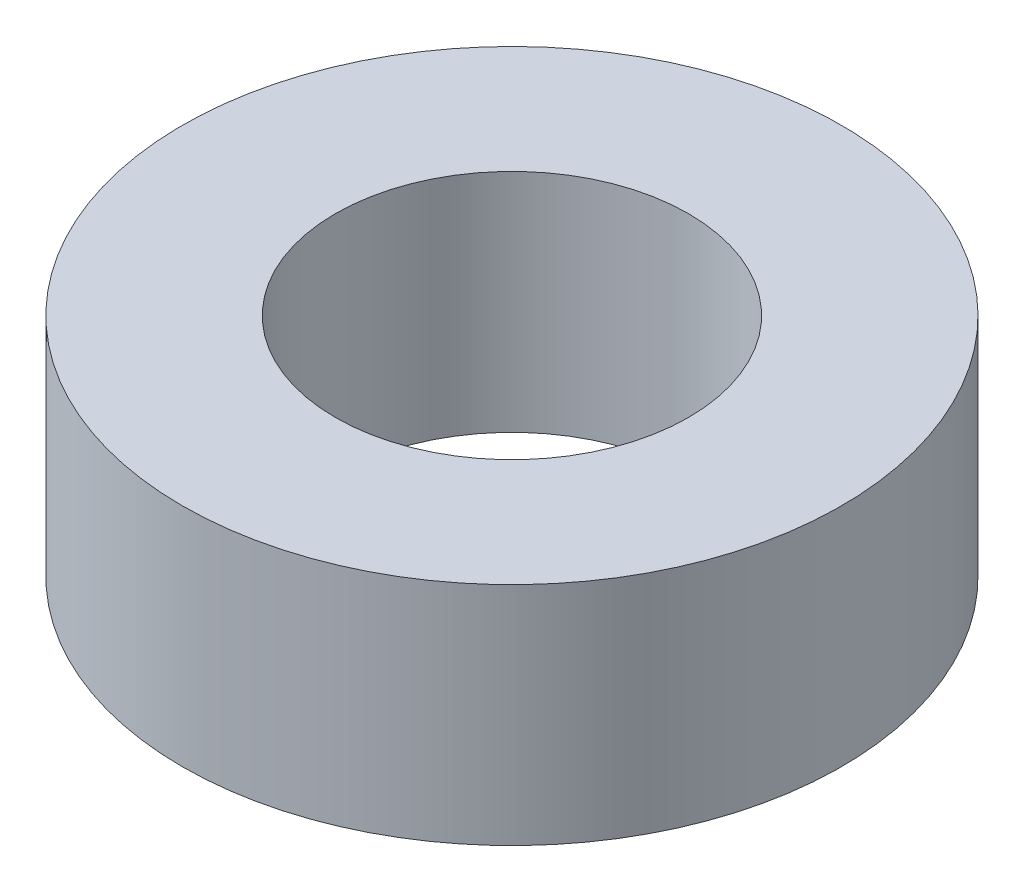
ISO-10303-21;
HEADER;
FILE_DESCRIPTION(('STEP AP214'),'2;1');
FILE_NAME('part.step','',(''),(''),'','','');
FILE_SCHEMA(('AUTOMOTIVE_DESIGN { 1 0 10303 214 1 1 1 1 }'));
ENDSEC;
DATA;
#1=APPLICATION_CONTEXT('core data for automotive mechanical design processes');
#2=APPLICATION_PROTOCOL_DEFINITION('international standard','automotive_design',2000,#1);
#3=PRODUCT_CONTEXT('',#1,'mechanical');
#4=PRODUCT('Part','Part','',(#3));
#5=PRODUCT_RELATED_PRODUCT_CATEGORY('part','',(#4));
#6=PRODUCT_DEFINITION_FORMATION('','',#4);
#7=PRODUCT_DEFINITION_CONTEXT('part definition',#1,'design');
#8=PRODUCT_DEFINITION('design','',#6,#7);
#9=PRODUCT_DEFINITION_SHAPE('','',#8);
#10=(LENGTH_UNIT() NAMED_UNIT(*) SI_UNIT(.MILLI.,.METRE.));
#11=(NAMED_UNIT(*) PLANE_ANGLE_UNIT() SI_UNIT($,.RADIAN.));
#12=(NAMED_UNIT(*) SI_UNIT($,.STERADIAN.) SOLID_ANGLE_UNIT());
#13=UNCERTAINTY_MEASURE_WITH_UNIT(LENGTH_MEASURE(1.E-05),#10,'distance_accuracy_value','');
#14=(GEOMETRIC_REPRESENTATION_CONTEXT(3) GLOBAL_UNCERTAINTY_ASSIGNED_CONTEXT((#13)) GLOBAL_UNIT_ASSIGNED_CONTEXT((#10,
#11,#12)) REPRESENTATION_CONTEXT('',''));
#15=CARTESIAN_POINT('',(0.,0.,0.));
#16=DIRECTION('',(0.,0.,1.));
#17=DIRECTION('',(1.,0.,0.));
#18=AXIS2_PLACEMENT_3D('',#15,#16,#17);
#19=CARTESIAN_POINT('',(0.,4.8,0.));
#20=DIRECTION('',(0.,-1.,0.));
#21=DIRECTION('',(0.,0.,-1.));
#22=AXIS2_PLACEMENT_3D('',#19,#20,#21);
#23=CYLINDRICAL_SURFACE('',#22,3.75);
#24=CARTESIAN_POINT('',(0.,4.8,0.));
#25=DIRECTION('',(0.,1.,0.));
#26=DIRECTION('',(0.,0.,1.));
#27=AXIS2_PLACEMENT_3D('',#24,#25,#26);
#28=CIRCLE('',#27,3.75);
#29=CARTESIAN_POINT('',(0.,4.8,3.75));
#30=VERTEX_POINT('',#29);
#31=EDGE_CURVE('E41',#30,#30,#28,.T.);
#32=ORIENTED_EDGE('',*,*,#31,.T.);
#33=EDGE_LOOP('',(#32));
#34=FACE_BOUND('',#33,.T.);
#35=CARTESIAN_POINT('',(0.,0.,0.));
#36=DIRECTION('',(0.,1.,0.));
#37=DIRECTION('',(0.,0.,1.));
#38=AXIS2_PLACEMENT_3D('',#35,#36,#37);
#39=CIRCLE('',#38,3.75);
#40=CARTESIAN_POINT('',(0.,0.,3.75));
#41=VERTEX_POINT('',#40);
#42=EDGE_CURVE('E47',#41,#41,#39,.T.);
#43=ORIENTED_EDGE('',*,*,#42,.F.);
#44=EDGE_LOOP('',(#43));
#45=FACE_BOUND('',#44,.T.);
#46=ADVANCED_FACE('F34',(#34,#45),#23,.F.);
#47=CARTESIAN_POINT('',(0.,4.8,0.));
#48=DIRECTION('',(0.,-1.,0.));
#49=DIRECTION('',(0.,0.,-1.));
#50=AXIS2_PLACEMENT_3D('',#47,#48,#49);
#51=CYLINDRICAL_SURFACE('',#50,7.);
#52=CARTESIAN_POINT('',(0.,4.8,0.));
#53=DIRECTION('',(0.,1.,0.));
#54=DIRECTION('',(0.,0.,1.));
#55=AXIS2_PLACEMENT_3D('',#52,#53,#54);
#56=CIRCLE('',#55,7.);
#57=CARTESIAN_POINT('',(0.,4.8,7.));
#58=VERTEX_POINT('',#57);
#59=EDGE_CURVE('E10',#58,#58,#56,.T.);
#60=ORIENTED_EDGE('',*,*,#59,.F.);
#61=EDGE_LOOP('',(#60));
#62=FACE_BOUND('',#61,.T.);
#63=CARTESIAN_POINT('',(0.,0.,0.));
#64=DIRECTION('',(0.,1.,0.));
#65=DIRECTION('',(0.,0.,1.));
#66=AXIS2_PLACEMENT_3D('',#63,#64,#65);
#67=CIRCLE('',#66,7.);
#68=CARTESIAN_POINT('',(0.,0.,7.));
#69=VERTEX_POINT('',#68);
#70=EDGE_CURVE('E37',#69,#69,#67,.T.);
#71=ORIENTED_EDGE('',*,*,#70,.T.);
#72=EDGE_LOOP('',(#71));
#73=FACE_BOUND('',#72,.T.);
#74=ADVANCED_FACE('F54',(#62,#73),#51,.T.);
#75=CARTESIAN_POINT('',(0.,4.8,0.));
#76=DIRECTION('',(0.,1.,0.));
#77=DIRECTION('',(0.,0.,1.));
#78=AXIS2_PLACEMENT_3D('',#75,#76,#77);
#79=PLANE('',#78);
#80=ORIENTED_EDGE('',*,*,#31,.F.);
#81=EDGE_LOOP('',(#80));
#82=FACE_BOUND('',#81,.T.);
#83=ORIENTED_EDGE('',*,*,#59,.T.);
#84=EDGE_LOOP('',(#83));
#85=FACE_BOUND('',#84,.T.);
#86=ADVANCED_FACE('F58',(#82,#85),#79,.T.);
#87=CARTESIAN_POINT('',(0.,0.,0.));
#88=DIRECTION('',(0.,1.,0.));
#89=DIRECTION('',(0.,0.,1.));
#90=AXIS2_PLACEMENT_3D('',#87,#88,#89);
#91=PLANE('',#90);
#92=ORIENTED_EDGE('',*,*,#42,.T.);
#93=EDGE_LOOP('',(#92));
#94=FACE_BOUND('',#93,.T.);
#95=ORIENTED_EDGE('',*,*,#70,.F.);
#96=EDGE_LOOP('',(#95));
#97=FACE_BOUND('',#96,.T.);
#98=ADVANCED_FACE('F56',(#94,#97),#91,.F.);
#99=CLOSED_SHELL('',(#46,#74,#86,#98));
#100=MANIFOLD_SOLID_BREP('B2',#99);
#101=ADVANCED_BREP_SHAPE_REPRESENTATION('',(#18,#100),#14);
#102=SHAPE_DEFINITION_REPRESENTATION(#9,#101);
ENDSEC;
END-ISO-10303-21;
